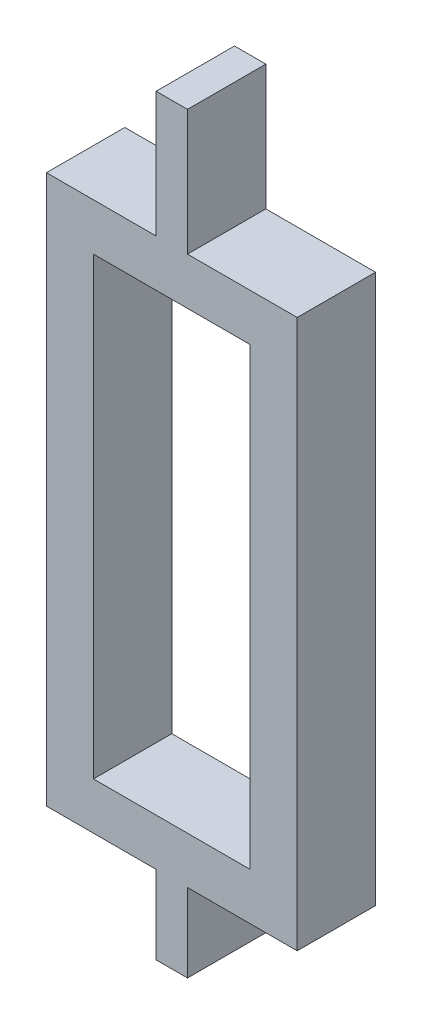
ISO-10303-21;
HEADER;
FILE_DESCRIPTION(('STEP AP214'),'2;1');
FILE_NAME('part.step','',(''),(''),'','','');
FILE_SCHEMA(('AUTOMOTIVE_DESIGN { 1 0 10303 214 1 1 1 1 }'));
ENDSEC;
DATA;
#1=APPLICATION_CONTEXT('core data for automotive mechanical design processes');
#2=APPLICATION_PROTOCOL_DEFINITION('international standard','automotive_design',2000,#1);
#3=PRODUCT_CONTEXT('',#1,'mechanical');
#4=PRODUCT('Part','Part','',(#3));
#5=PRODUCT_RELATED_PRODUCT_CATEGORY('part','',(#4));
#6=PRODUCT_DEFINITION_FORMATION('','',#4);
#7=PRODUCT_DEFINITION_CONTEXT('part definition',#1,'design');
#8=PRODUCT_DEFINITION('design','',#6,#7);
#9=PRODUCT_DEFINITION_SHAPE('','',#8);
#10=(LENGTH_UNIT() NAMED_UNIT(*) SI_UNIT(.MILLI.,.METRE.));
#11=(NAMED_UNIT(*) PLANE_ANGLE_UNIT() SI_UNIT($,.RADIAN.));
#12=(NAMED_UNIT(*) SI_UNIT($,.STERADIAN.) SOLID_ANGLE_UNIT());
#13=UNCERTAINTY_MEASURE_WITH_UNIT(LENGTH_MEASURE(1.E-05),#10,'distance_accuracy_value','');
#14=(GEOMETRIC_REPRESENTATION_CONTEXT(3) GLOBAL_UNCERTAINTY_ASSIGNED_CONTEXT((#13)) GLOBAL_UNIT_ASSIGNED_CONTEXT((#10,
#11,#12)) REPRESENTATION_CONTEXT('',''));
#15=CARTESIAN_POINT('',(0.,0.,0.));
#16=DIRECTION('',(0.,0.,1.));
#17=DIRECTION('',(1.,0.,0.));
#18=AXIS2_PLACEMENT_3D('',#15,#16,#17);
#19=CARTESIAN_POINT('',(-10.16,0.0220030941736216,6.35));
#20=DIRECTION('',(0.,1.,0.));
#21=DIRECTION('',(-1.,0.,0.));
#22=AXIS2_PLACEMENT_3D('',#19,#20,#21);
#23=PLANE('',#22);
#24=DIRECTION('',(1.,0.,0.));
#25=VECTOR('',#24,1.);
#26=CARTESIAN_POINT('',(-10.16,0.0220030941736216,0.));
#27=LINE('',#26,#25);
#28=CARTESIAN_POINT('',(-10.16,0.0220030941736216,0.));
#29=VERTEX_POINT('',#28);
#30=CARTESIAN_POINT('',(-1.27,0.0220030941736213,0.));
#31=VERTEX_POINT('',#30);
#32=EDGE_CURVE('E183',#29,#31,#27,.T.);
#33=ORIENTED_EDGE('',*,*,#32,.T.);
#34=DIRECTION('',(0.,0.,-1.));
#35=VECTOR('',#34,1.);
#36=CARTESIAN_POINT('',(-1.27,0.0220030941736213,6.35));
#37=LINE('',#36,#35);
#38=CARTESIAN_POINT('',(-1.27,0.0220030941736213,6.35));
#39=VERTEX_POINT('',#38);
#40=EDGE_CURVE('E11',#39,#31,#37,.T.);
#41=ORIENTED_EDGE('',*,*,#40,.F.);
#42=DIRECTION('',(1.,0.,0.));
#43=VECTOR('',#42,1.);
#44=CARTESIAN_POINT('',(-10.16,0.0220030941736216,6.35));
#45=LINE('',#44,#43);
#46=CARTESIAN_POINT('',(-10.16,0.0220030941736216,6.35));
#47=VERTEX_POINT('',#46);
#48=EDGE_CURVE('E187',#47,#39,#45,.T.);
#49=ORIENTED_EDGE('',*,*,#48,.F.);
#50=DIRECTION('',(0.,0.,-1.));
#51=VECTOR('',#50,1.);
#52=CARTESIAN_POINT('',(-10.16,0.0220030941736216,6.35));
#53=LINE('',#52,#51);
#54=EDGE_CURVE('E213',#47,#29,#53,.T.);
#55=ORIENTED_EDGE('',*,*,#54,.T.);
#56=EDGE_LOOP('',(#33,#41,#49,#55));
#57=FACE_BOUND('',#56,.T.);
#58=ADVANCED_FACE('F38',(#57),#23,.F.);
#59=CARTESIAN_POINT('',(-1.27,0.0220030941736213,6.35));
#60=DIRECTION('',(1.,0.,0.));
#61=DIRECTION('',(0.,1.,0.));
#62=AXIS2_PLACEMENT_3D('',#59,#60,#61);
#63=PLANE('',#62);
#64=DIRECTION('',(0.,-1.,0.));
#65=VECTOR('',#64,1.);
#66=CARTESIAN_POINT('',(-1.27,0.0220030941736213,0.));
#67=LINE('',#66,#65);
#68=CARTESIAN_POINT('',(-1.27,-6.32799690582638,0.));
#69=VERTEX_POINT('',#68);
#70=EDGE_CURVE('E216',#31,#69,#67,.T.);
#71=ORIENTED_EDGE('',*,*,#70,.T.);
#72=DIRECTION('',(0.,0.,-1.));
#73=VECTOR('',#72,1.);
#74=CARTESIAN_POINT('',(-1.27,-6.32799690582638,6.35));
#75=LINE('',#74,#73);
#76=CARTESIAN_POINT('',(-1.27,-6.32799690582638,6.35));
#77=VERTEX_POINT('',#76);
#78=EDGE_CURVE('E45',#77,#69,#75,.T.);
#79=ORIENTED_EDGE('',*,*,#78,.F.);
#80=DIRECTION('',(0.,-1.,0.));
#81=VECTOR('',#80,1.);
#82=CARTESIAN_POINT('',(-1.27,0.0220030941736213,6.35));
#83=LINE('',#82,#81);
#84=EDGE_CURVE('E190',#39,#77,#83,.T.);
#85=ORIENTED_EDGE('',*,*,#84,.F.);
#86=ORIENTED_EDGE('',*,*,#40,.T.);
#87=EDGE_LOOP('',(#71,#79,#85,#86));
#88=FACE_BOUND('',#87,.T.);
#89=ADVANCED_FACE('F291',(#88),#63,.F.);
#90=CARTESIAN_POINT('',(-1.27,-6.32799690582638,6.35));
#91=DIRECTION('',(0.,1.,0.));
#92=DIRECTION('',(-1.,0.,0.));
#93=AXIS2_PLACEMENT_3D('',#90,#91,#92);
#94=PLANE('',#93);
#95=DIRECTION('',(1.,0.,0.));
#96=VECTOR('',#95,1.);
#97=CARTESIAN_POINT('',(-1.27,-6.32799690582638,0.));
#98=LINE('',#97,#96);
#99=CARTESIAN_POINT('',(1.27,-6.32799690582638,0.));
#100=VERTEX_POINT('',#99);
#101=EDGE_CURVE('E218',#69,#100,#98,.T.);
#102=ORIENTED_EDGE('',*,*,#101,.T.);
#103=DIRECTION('',(0.,0.,-1.));
#104=VECTOR('',#103,1.);
#105=CARTESIAN_POINT('',(1.27,-6.32799690582638,6.35));
#106=LINE('',#105,#104);
#107=CARTESIAN_POINT('',(1.27,-6.32799690582638,6.35));
#108=VERTEX_POINT('',#107);
#109=EDGE_CURVE('E263',#108,#100,#106,.T.);
#110=ORIENTED_EDGE('',*,*,#109,.F.);
#111=DIRECTION('',(1.,0.,0.));
#112=VECTOR('',#111,1.);
#113=CARTESIAN_POINT('',(-1.27,-6.32799690582638,6.35));
#114=LINE('',#113,#112);
#115=EDGE_CURVE('E193',#77,#108,#114,.T.);
#116=ORIENTED_EDGE('',*,*,#115,.F.);
#117=ORIENTED_EDGE('',*,*,#78,.T.);
#118=EDGE_LOOP('',(#102,#110,#116,#117));
#119=FACE_BOUND('',#118,.T.);
#120=ADVANCED_FACE('F270',(#119),#94,.F.);
#121=CARTESIAN_POINT('',(1.27,0.0220030941736213,6.35));
#122=DIRECTION('',(-1.,0.,0.));
#123=DIRECTION('',(0.,-1.,0.));
#124=AXIS2_PLACEMENT_3D('',#121,#122,#123);
#125=PLANE('',#124);
#126=DIRECTION('',(0.,1.,0.));
#127=VECTOR('',#126,1.);
#128=CARTESIAN_POINT('',(1.27,0.0220030941736213,0.));
#129=LINE('',#128,#127);
#130=CARTESIAN_POINT('',(1.27,0.0220030941736213,0.));
#131=VERTEX_POINT('',#130);
#132=EDGE_CURVE('E220',#100,#131,#129,.T.);
#133=ORIENTED_EDGE('',*,*,#132,.T.);
#134=DIRECTION('',(0.,0.,-1.));
#135=VECTOR('',#134,1.);
#136=CARTESIAN_POINT('',(1.27,0.0220030941736213,6.35));
#137=LINE('',#136,#135);
#138=CARTESIAN_POINT('',(1.27,0.0220030941736213,6.35));
#139=VERTEX_POINT('',#138);
#140=EDGE_CURVE('E260',#139,#131,#137,.T.);
#141=ORIENTED_EDGE('',*,*,#140,.F.);
#142=DIRECTION('',(0.,1.,0.));
#143=VECTOR('',#142,1.);
#144=CARTESIAN_POINT('',(1.27,0.0220030941736213,6.35));
#145=LINE('',#144,#143);
#146=EDGE_CURVE('E195',#108,#139,#145,.T.);
#147=ORIENTED_EDGE('',*,*,#146,.F.);
#148=ORIENTED_EDGE('',*,*,#109,.T.);
#149=EDGE_LOOP('',(#133,#141,#147,#148));
#150=FACE_BOUND('',#149,.T.);
#151=ADVANCED_FACE('F279',(#150),#125,.F.);
#152=CARTESIAN_POINT('',(10.16,0.0220030941736241,6.35));
#153=DIRECTION('',(0.,1.,0.));
#154=DIRECTION('',(-1.,0.,0.));
#155=AXIS2_PLACEMENT_3D('',#152,#153,#154);
#156=PLANE('',#155);
#157=DIRECTION('',(1.,0.,0.));
#158=VECTOR('',#157,1.);
#159=CARTESIAN_POINT('',(10.16,0.0220030941736241,0.));
#160=LINE('',#159,#158);
#161=CARTESIAN_POINT('',(10.16,0.0220030941736241,0.));
#162=VERTEX_POINT('',#161);
#163=EDGE_CURVE('E222',#131,#162,#160,.T.);
#164=ORIENTED_EDGE('',*,*,#163,.T.);
#165=DIRECTION('',(0.,0.,-1.));
#166=VECTOR('',#165,1.);
#167=CARTESIAN_POINT('',(10.16,0.0220030941736241,6.35));
#168=LINE('',#167,#166);
#169=CARTESIAN_POINT('',(10.16,0.0220030941736241,6.35));
#170=VERTEX_POINT('',#169);
#171=EDGE_CURVE('E257',#170,#162,#168,.T.);
#172=ORIENTED_EDGE('',*,*,#171,.F.);
#173=DIRECTION('',(1.,0.,0.));
#174=VECTOR('',#173,1.);
#175=CARTESIAN_POINT('',(10.16,0.0220030941736241,6.35));
#176=LINE('',#175,#174);
#177=EDGE_CURVE('E197',#139,#170,#176,.T.);
#178=ORIENTED_EDGE('',*,*,#177,.F.);
#179=ORIENTED_EDGE('',*,*,#140,.T.);
#180=EDGE_LOOP('',(#164,#172,#178,#179));
#181=FACE_BOUND('',#180,.T.);
#182=ADVANCED_FACE('F283',(#181),#156,.F.);
#183=CARTESIAN_POINT('',(10.16,0.0220030941736241,6.35));
#184=DIRECTION('',(-1.,0.,0.));
#185=DIRECTION('',(0.,0.,1.));
#186=AXIS2_PLACEMENT_3D('',#183,#184,#185);
#187=PLANE('',#186);
#188=DIRECTION('',(0.,1.,0.));
#189=VECTOR('',#188,1.);
#190=CARTESIAN_POINT('',(10.16,0.0220030941736241,0.));
#191=LINE('',#190,#189);
#192=CARTESIAN_POINT('',(10.16,44.4720030941736,0.));
#193=VERTEX_POINT('',#192);
#194=EDGE_CURVE('E224',#162,#193,#191,.T.);
#195=ORIENTED_EDGE('',*,*,#194,.T.);
#196=DIRECTION('',(0.,0.,-1.));
#197=VECTOR('',#196,1.);
#198=CARTESIAN_POINT('',(10.16,44.4720030941736,6.35));
#199=LINE('',#198,#197);
#200=CARTESIAN_POINT('',(10.16,44.4720030941736,6.35));
#201=VERTEX_POINT('',#200);
#202=EDGE_CURVE('E254',#201,#193,#199,.T.);
#203=ORIENTED_EDGE('',*,*,#202,.F.);
#204=DIRECTION('',(0.,1.,0.));
#205=VECTOR('',#204,1.);
#206=CARTESIAN_POINT('',(10.16,0.0220030941736241,6.35));
#207=LINE('',#206,#205);
#208=EDGE_CURVE('E199',#170,#201,#207,.T.);
#209=ORIENTED_EDGE('',*,*,#208,.F.);
#210=ORIENTED_EDGE('',*,*,#171,.T.);
#211=EDGE_LOOP('',(#195,#203,#209,#210));
#212=FACE_BOUND('',#211,.T.);
#213=ADVANCED_FACE('F324',(#212),#187,.F.);
#214=CARTESIAN_POINT('',(10.16,44.4720030941736,6.35));
#215=DIRECTION('',(0.,-1.,0.));
#216=DIRECTION('',(0.,0.,-1.));
#217=AXIS2_PLACEMENT_3D('',#214,#215,#216);
#218=PLANE('',#217);
#219=DIRECTION('',(-1.,0.,0.));
#220=VECTOR('',#219,1.);
#221=CARTESIAN_POINT('',(10.16,44.4720030941736,0.));
#222=LINE('',#221,#220);
#223=CARTESIAN_POINT('',(1.26999999999999,44.4720030941736,0.));
#224=VERTEX_POINT('',#223);
#225=EDGE_CURVE('E226',#193,#224,#222,.T.);
#226=ORIENTED_EDGE('',*,*,#225,.T.);
#227=DIRECTION('',(0.,0.,-1.));
#228=VECTOR('',#227,1.);
#229=CARTESIAN_POINT('',(1.26999999999999,44.4720030941736,6.35));
#230=LINE('',#229,#228);
#231=CARTESIAN_POINT('',(1.26999999999999,44.4720030941736,6.35));
#232=VERTEX_POINT('',#231);
#233=EDGE_CURVE('E251',#232,#224,#230,.T.);
#234=ORIENTED_EDGE('',*,*,#233,.F.);
#235=DIRECTION('',(-1.,0.,0.));
#236=VECTOR('',#235,1.);
#237=CARTESIAN_POINT('',(10.16,44.4720030941736,6.35));
#238=LINE('',#237,#236);
#239=EDGE_CURVE('E201',#201,#232,#238,.T.);
#240=ORIENTED_EDGE('',*,*,#239,.F.);
#241=ORIENTED_EDGE('',*,*,#202,.T.);
#242=EDGE_LOOP('',(#226,#234,#240,#241));
#243=FACE_BOUND('',#242,.T.);
#244=ADVANCED_FACE('F322',(#243),#218,.F.);
#245=CARTESIAN_POINT('',(1.26999999999998,54.6320030941736,6.35));
#246=DIRECTION('',(-1.,0.,0.));
#247=DIRECTION('',(0.,-1.,0.));
#248=AXIS2_PLACEMENT_3D('',#245,#246,#247);
#249=PLANE('',#248);
#250=DIRECTION('',(0.,1.,0.));
#251=VECTOR('',#250,1.);
#252=CARTESIAN_POINT('',(1.26999999999998,54.6320030941736,0.));
#253=LINE('',#252,#251);
#254=CARTESIAN_POINT('',(1.26999999999998,54.6320030941736,0.));
#255=VERTEX_POINT('',#254);
#256=EDGE_CURVE('E228',#224,#255,#253,.T.);
#257=ORIENTED_EDGE('',*,*,#256,.T.);
#258=DIRECTION('',(0.,0.,-1.));
#259=VECTOR('',#258,1.);
#260=CARTESIAN_POINT('',(1.26999999999998,54.6320030941736,6.35));
#261=LINE('',#260,#259);
#262=CARTESIAN_POINT('',(1.26999999999998,54.6320030941736,6.35));
#263=VERTEX_POINT('',#262);
#264=EDGE_CURVE('E248',#263,#255,#261,.T.);
#265=ORIENTED_EDGE('',*,*,#264,.F.);
#266=DIRECTION('',(0.,1.,0.));
#267=VECTOR('',#266,1.);
#268=CARTESIAN_POINT('',(1.26999999999998,54.6320030941736,6.35));
#269=LINE('',#268,#267);
#270=EDGE_CURVE('E203',#232,#263,#269,.T.);
#271=ORIENTED_EDGE('',*,*,#270,.F.);
#272=ORIENTED_EDGE('',*,*,#233,.T.);
#273=EDGE_LOOP('',(#257,#265,#271,#272));
#274=FACE_BOUND('',#273,.T.);
#275=ADVANCED_FACE('F318',(#274),#249,.F.);
#276=CARTESIAN_POINT('',(-1.26999999999999,54.6320030941736,6.35));
#277=DIRECTION('',(0.,-1.,0.));
#278=DIRECTION('',(0.,0.,-1.));
#279=AXIS2_PLACEMENT_3D('',#276,#277,#278);
#280=PLANE('',#279);
#281=DIRECTION('',(-1.,0.,0.));
#282=VECTOR('',#281,1.);
#283=CARTESIAN_POINT('',(-1.26999999999999,54.6320030941736,0.));
#284=LINE('',#283,#282);
#285=CARTESIAN_POINT('',(-1.26999999999999,54.6320030941736,0.));
#286=VERTEX_POINT('',#285);
#287=EDGE_CURVE('E230',#255,#286,#284,.T.);
#288=ORIENTED_EDGE('',*,*,#287,.T.);
#289=DIRECTION('',(0.,0.,-1.));
#290=VECTOR('',#289,1.);
#291=CARTESIAN_POINT('',(-1.26999999999999,54.6320030941736,6.35));
#292=LINE('',#291,#290);
#293=CARTESIAN_POINT('',(-1.26999999999999,54.6320030941736,6.35));
#294=VERTEX_POINT('',#293);
#295=EDGE_CURVE('E245',#294,#286,#292,.T.);
#296=ORIENTED_EDGE('',*,*,#295,.F.);
#297=DIRECTION('',(-1.,0.,0.));
#298=VECTOR('',#297,1.);
#299=CARTESIAN_POINT('',(-1.26999999999999,54.6320030941736,6.35));
#300=LINE('',#299,#298);
#301=EDGE_CURVE('E205',#263,#294,#300,.T.);
#302=ORIENTED_EDGE('',*,*,#301,.F.);
#303=ORIENTED_EDGE('',*,*,#264,.T.);
#304=EDGE_LOOP('',(#288,#296,#302,#303));
#305=FACE_BOUND('',#304,.T.);
#306=ADVANCED_FACE('F313',(#305),#280,.F.);
#307=CARTESIAN_POINT('',(-1.27000000000001,44.4720030941736,6.35));
#308=DIRECTION('',(1.,0.,0.));
#309=DIRECTION('',(0.,1.,0.));
#310=AXIS2_PLACEMENT_3D('',#307,#308,#309);
#311=PLANE('',#310);
#312=DIRECTION('',(0.,-1.,0.));
#313=VECTOR('',#312,1.);
#314=CARTESIAN_POINT('',(-1.27000000000001,44.4720030941736,0.));
#315=LINE('',#314,#313);
#316=CARTESIAN_POINT('',(-1.27000000000001,44.4720030941736,0.));
#317=VERTEX_POINT('',#316);
#318=EDGE_CURVE('E232',#286,#317,#315,.T.);
#319=ORIENTED_EDGE('',*,*,#318,.T.);
#320=DIRECTION('',(0.,0.,-1.));
#321=VECTOR('',#320,1.);
#322=CARTESIAN_POINT('',(-1.27000000000001,44.4720030941736,6.35));
#323=LINE('',#322,#321);
#324=CARTESIAN_POINT('',(-1.27000000000001,44.4720030941736,6.35));
#325=VERTEX_POINT('',#324);
#326=EDGE_CURVE('E242',#325,#317,#323,.T.);
#327=ORIENTED_EDGE('',*,*,#326,.F.);
#328=DIRECTION('',(0.,-1.,0.));
#329=VECTOR('',#328,1.);
#330=CARTESIAN_POINT('',(-1.27000000000001,44.4720030941736,6.35));
#331=LINE('',#330,#329);
#332=EDGE_CURVE('E207',#294,#325,#331,.T.);
#333=ORIENTED_EDGE('',*,*,#332,.F.);
#334=ORIENTED_EDGE('',*,*,#295,.T.);
#335=EDGE_LOOP('',(#319,#327,#333,#334));
#336=FACE_BOUND('',#335,.T.);
#337=ADVANCED_FACE('F307',(#336),#311,.F.);
#338=CARTESIAN_POINT('',(-10.16,44.4720030941736,6.35));
#339=DIRECTION('',(0.,-1.,0.));
#340=DIRECTION('',(0.,0.,-1.));
#341=AXIS2_PLACEMENT_3D('',#338,#339,#340);
#342=PLANE('',#341);
#343=DIRECTION('',(-1.,0.,0.));
#344=VECTOR('',#343,1.);
#345=CARTESIAN_POINT('',(-10.16,44.4720030941736,0.));
#346=LINE('',#345,#344);
#347=CARTESIAN_POINT('',(-10.16,44.4720030941736,0.));
#348=VERTEX_POINT('',#347);
#349=EDGE_CURVE('E234',#317,#348,#346,.T.);
#350=ORIENTED_EDGE('',*,*,#349,.T.);
#351=DIRECTION('',(0.,0.,-1.));
#352=VECTOR('',#351,1.);
#353=CARTESIAN_POINT('',(-10.16,44.4720030941736,6.35));
#354=LINE('',#353,#352);
#355=CARTESIAN_POINT('',(-10.16,44.4720030941736,6.35));
#356=VERTEX_POINT('',#355);
#357=EDGE_CURVE('E239',#356,#348,#354,.T.);
#358=ORIENTED_EDGE('',*,*,#357,.F.);
#359=DIRECTION('',(-1.,0.,0.));
#360=VECTOR('',#359,1.);
#361=CARTESIAN_POINT('',(-10.16,44.4720030941736,6.35));
#362=LINE('',#361,#360);
#363=EDGE_CURVE('E209',#325,#356,#362,.T.);
#364=ORIENTED_EDGE('',*,*,#363,.F.);
#365=ORIENTED_EDGE('',*,*,#326,.T.);
#366=EDGE_LOOP('',(#350,#358,#364,#365));
#367=FACE_BOUND('',#366,.T.);
#368=ADVANCED_FACE('F303',(#367),#342,.F.);
#369=CARTESIAN_POINT('',(-10.16,44.4720030941736,6.35));
#370=DIRECTION('',(1.,0.,0.));
#371=DIRECTION('',(0.,0.,-1.));
#372=AXIS2_PLACEMENT_3D('',#369,#370,#371);
#373=PLANE('',#372);
#374=DIRECTION('',(0.,-1.,0.));
#375=VECTOR('',#374,1.);
#376=CARTESIAN_POINT('',(-10.16,44.4720030941736,0.));
#377=LINE('',#376,#375);
#378=EDGE_CURVE('E191',#348,#29,#377,.T.);
#379=ORIENTED_EDGE('',*,*,#378,.T.);
#380=ORIENTED_EDGE('',*,*,#54,.F.);
#381=DIRECTION('',(0.,-1.,0.));
#382=VECTOR('',#381,1.);
#383=CARTESIAN_POINT('',(-10.16,44.4720030941736,6.35));
#384=LINE('',#383,#382);
#385=EDGE_CURVE('E211',#356,#47,#384,.T.);
#386=ORIENTED_EDGE('',*,*,#385,.F.);
#387=ORIENTED_EDGE('',*,*,#357,.T.);
#388=EDGE_LOOP('',(#379,#380,#386,#387));
#389=FACE_BOUND('',#388,.T.);
#390=ADVANCED_FACE('F298',(#389),#373,.F.);
#391=CARTESIAN_POINT('',(0.,0.,6.35));
#392=DIRECTION('',(0.,0.,-1.));
#393=DIRECTION('',(-1.,0.,0.));
#394=AXIS2_PLACEMENT_3D('',#391,#392,#393);
#395=PLANE('',#394);
#396=DIRECTION('',(0.,-1.,0.));
#397=VECTOR('',#396,1.);
#398=CARTESIAN_POINT('',(-6.35,40.6620030941736,6.35));
#399=LINE('',#398,#397);
#400=CARTESIAN_POINT('',(-6.35,40.6620030941736,6.35));
#401=VERTEX_POINT('',#400);
#402=CARTESIAN_POINT('',(-6.35,3.83200309417362,6.35));
#403=VERTEX_POINT('',#402);
#404=EDGE_CURVE('E177',#401,#403,#399,.T.);
#405=ORIENTED_EDGE('',*,*,#404,.F.);
#406=DIRECTION('',(-1.,0.,0.));
#407=VECTOR('',#406,1.);
#408=CARTESIAN_POINT('',(6.35,40.6620030941736,6.35));
#409=LINE('',#408,#407);
#410=CARTESIAN_POINT('',(6.35,40.6620030941736,6.35));
#411=VERTEX_POINT('',#410);
#412=EDGE_CURVE('E52',#411,#401,#409,.T.);
#413=ORIENTED_EDGE('',*,*,#412,.F.);
#414=DIRECTION('',(0.,1.,0.));
#415=VECTOR('',#414,1.);
#416=CARTESIAN_POINT('',(6.35,3.83200309417362,6.35));
#417=LINE('',#416,#415);
#418=CARTESIAN_POINT('',(6.35,3.83200309417362,6.35));
#419=VERTEX_POINT('',#418);
#420=EDGE_CURVE('E168',#419,#411,#417,.T.);
#421=ORIENTED_EDGE('',*,*,#420,.F.);
#422=DIRECTION('',(1.,0.,0.));
#423=VECTOR('',#422,1.);
#424=CARTESIAN_POINT('',(-6.35,3.83200309417362,6.35));
#425=LINE('',#424,#423);
#426=EDGE_CURVE('E171',#403,#419,#425,.T.);
#427=ORIENTED_EDGE('',*,*,#426,.F.);
#428=EDGE_LOOP('',(#405,#413,#421,#427));
#429=FACE_BOUND('',#428,.T.);
#430=ORIENTED_EDGE('',*,*,#48,.T.);
#431=ORIENTED_EDGE('',*,*,#84,.T.);
#432=ORIENTED_EDGE('',*,*,#115,.T.);
#433=ORIENTED_EDGE('',*,*,#146,.T.);
#434=ORIENTED_EDGE('',*,*,#177,.T.);
#435=ORIENTED_EDGE('',*,*,#208,.T.);
#436=ORIENTED_EDGE('',*,*,#239,.T.);
#437=ORIENTED_EDGE('',*,*,#270,.T.);
#438=ORIENTED_EDGE('',*,*,#301,.T.);
#439=ORIENTED_EDGE('',*,*,#332,.T.);
#440=ORIENTED_EDGE('',*,*,#363,.T.);
#441=ORIENTED_EDGE('',*,*,#385,.T.);
#442=EDGE_LOOP('',(#430,#431,#432,#433,#434,#435,#436,#437,#438,#439,#440,#441));
#443=FACE_BOUND('',#442,.T.);
#444=ADVANCED_FACE('F287',(#429,#443),#395,.F.);
#445=CARTESIAN_POINT('',(0.,0.,0.));
#446=DIRECTION('',(0.,0.,-1.));
#447=DIRECTION('',(-1.,0.,0.));
#448=AXIS2_PLACEMENT_3D('',#445,#446,#447);
#449=PLANE('',#448);
#450=DIRECTION('',(-1.,0.,0.));
#451=VECTOR('',#450,1.);
#452=CARTESIAN_POINT('',(6.35,40.6620030941736,0.));
#453=LINE('',#452,#451);
#454=CARTESIAN_POINT('',(6.35,40.6620030941736,0.));
#455=VERTEX_POINT('',#454);
#456=CARTESIAN_POINT('',(-6.35,40.6620030941736,0.));
#457=VERTEX_POINT('',#456);
#458=EDGE_CURVE('E152',#455,#457,#453,.T.);
#459=ORIENTED_EDGE('',*,*,#458,.T.);
#460=DIRECTION('',(0.,-1.,0.));
#461=VECTOR('',#460,1.);
#462=CARTESIAN_POINT('',(-6.35,40.6620030941736,0.));
#463=LINE('',#462,#461);
#464=CARTESIAN_POINT('',(-6.35,3.83200309417362,0.));
#465=VERTEX_POINT('',#464);
#466=EDGE_CURVE('E161',#457,#465,#463,.T.);
#467=ORIENTED_EDGE('',*,*,#466,.T.);
#468=DIRECTION('',(1.,0.,0.));
#469=VECTOR('',#468,1.);
#470=CARTESIAN_POINT('',(-6.35,3.83200309417362,0.));
#471=LINE('',#470,#469);
#472=CARTESIAN_POINT('',(6.35,3.83200309417362,0.));
#473=VERTEX_POINT('',#472);
#474=EDGE_CURVE('E60',#465,#473,#471,.T.);
#475=ORIENTED_EDGE('',*,*,#474,.T.);
#476=DIRECTION('',(0.,1.,0.));
#477=VECTOR('',#476,1.);
#478=CARTESIAN_POINT('',(6.35,3.83200309417362,0.));
#479=LINE('',#478,#477);
#480=EDGE_CURVE('E158',#473,#455,#479,.T.);
#481=ORIENTED_EDGE('',*,*,#480,.T.);
#482=EDGE_LOOP('',(#459,#467,#475,#481));
#483=FACE_BOUND('',#482,.T.);
#484=ORIENTED_EDGE('',*,*,#32,.F.);
#485=ORIENTED_EDGE('',*,*,#378,.F.);
#486=ORIENTED_EDGE('',*,*,#349,.F.);
#487=ORIENTED_EDGE('',*,*,#318,.F.);
#488=ORIENTED_EDGE('',*,*,#287,.F.);
#489=ORIENTED_EDGE('',*,*,#256,.F.);
#490=ORIENTED_EDGE('',*,*,#225,.F.);
#491=ORIENTED_EDGE('',*,*,#194,.F.);
#492=ORIENTED_EDGE('',*,*,#163,.F.);
#493=ORIENTED_EDGE('',*,*,#132,.F.);
#494=ORIENTED_EDGE('',*,*,#101,.F.);
#495=ORIENTED_EDGE('',*,*,#70,.F.);
#496=EDGE_LOOP('',(#484,#485,#486,#487,#488,#489,#490,#491,#492,#493,#494,#495));
#497=FACE_BOUND('',#496,.T.);
#498=ADVANCED_FACE('F165',(#483,#497),#449,.T.);
#499=CARTESIAN_POINT('',(6.35,40.6620030941736,0.));
#500=DIRECTION('',(0.,1.,0.));
#501=DIRECTION('',(-1.,0.,0.));
#502=AXIS2_PLACEMENT_3D('',#499,#500,#501);
#503=PLANE('',#502);
#504=ORIENTED_EDGE('',*,*,#412,.T.);
#505=DIRECTION('',(0.,0.,1.));
#506=VECTOR('',#505,1.);
#507=CARTESIAN_POINT('',(-6.35,40.6620030941736,0.));
#508=LINE('',#507,#506);
#509=EDGE_CURVE('E148',#457,#401,#508,.T.);
#510=ORIENTED_EDGE('',*,*,#509,.F.);
#511=ORIENTED_EDGE('',*,*,#458,.F.);
#512=DIRECTION('',(0.,0.,1.));
#513=VECTOR('',#512,1.);
#514=CARTESIAN_POINT('',(6.35,40.6620030941736,0.));
#515=LINE('',#514,#513);
#516=EDGE_CURVE('E181',#455,#411,#515,.T.);
#517=ORIENTED_EDGE('',*,*,#516,.T.);
#518=EDGE_LOOP('',(#504,#510,#511,#517));
#519=FACE_BOUND('',#518,.T.);
#520=ADVANCED_FACE('F150',(#519),#503,.F.);
#521=CARTESIAN_POINT('',(6.35,3.83200309417362,0.));
#522=DIRECTION('',(1.,0.,0.));
#523=DIRECTION('',(0.,0.,-1.));
#524=AXIS2_PLACEMENT_3D('',#521,#522,#523);
#525=PLANE('',#524);
#526=ORIENTED_EDGE('',*,*,#420,.T.);
#527=ORIENTED_EDGE('',*,*,#516,.F.);
#528=ORIENTED_EDGE('',*,*,#480,.F.);
#529=DIRECTION('',(0.,0.,1.));
#530=VECTOR('',#529,1.);
#531=CARTESIAN_POINT('',(6.35,3.83200309417362,0.));
#532=LINE('',#531,#530);
#533=EDGE_CURVE('E184',#473,#419,#532,.T.);
#534=ORIENTED_EDGE('',*,*,#533,.T.);
#535=EDGE_LOOP('',(#526,#527,#528,#534));
#536=FACE_BOUND('',#535,.T.);
#537=ADVANCED_FACE('F427',(#536),#525,.F.);
#538=CARTESIAN_POINT('',(-6.35,3.83200309417362,0.));
#539=DIRECTION('',(0.,-1.,0.));
#540=DIRECTION('',(1.,0.,0.));
#541=AXIS2_PLACEMENT_3D('',#538,#539,#540);
#542=PLANE('',#541);
#543=ORIENTED_EDGE('',*,*,#426,.T.);
#544=ORIENTED_EDGE('',*,*,#533,.F.);
#545=ORIENTED_EDGE('',*,*,#474,.F.);
#546=DIRECTION('',(0.,0.,1.));
#547=VECTOR('',#546,1.);
#548=CARTESIAN_POINT('',(-6.35,3.83200309417362,0.));
#549=LINE('',#548,#547);
#550=EDGE_CURVE('E157',#465,#403,#549,.T.);
#551=ORIENTED_EDGE('',*,*,#550,.T.);
#552=EDGE_LOOP('',(#543,#544,#545,#551));
#553=FACE_BOUND('',#552,.T.);
#554=ADVANCED_FACE('F436',(#553),#542,.F.);
#555=CARTESIAN_POINT('',(-6.35,40.6620030941736,0.));
#556=DIRECTION('',(-1.,0.,0.));
#557=DIRECTION('',(0.,0.,1.));
#558=AXIS2_PLACEMENT_3D('',#555,#556,#557);
#559=PLANE('',#558);
#560=ORIENTED_EDGE('',*,*,#404,.T.);
#561=ORIENTED_EDGE('',*,*,#550,.F.);
#562=ORIENTED_EDGE('',*,*,#466,.F.);
#563=ORIENTED_EDGE('',*,*,#509,.T.);
#564=EDGE_LOOP('',(#560,#561,#562,#563));
#565=FACE_BOUND('',#564,.T.);
#566=ADVANCED_FACE('F162',(#565),#559,.F.);
#567=CLOSED_SHELL('',(#58,#89,#120,#151,#182,#213,#244,#275,#306,#337,#368,#390,#444,#498,#520,
#537,#554,#566));
#568=MANIFOLD_SOLID_BREP('B2',#567);
#569=ADVANCED_BREP_SHAPE_REPRESENTATION('',(#18,#568),#14);
#570=SHAPE_DEFINITION_REPRESENTATION(#9,#569);
ENDSEC;
END-ISO-10303-21;
